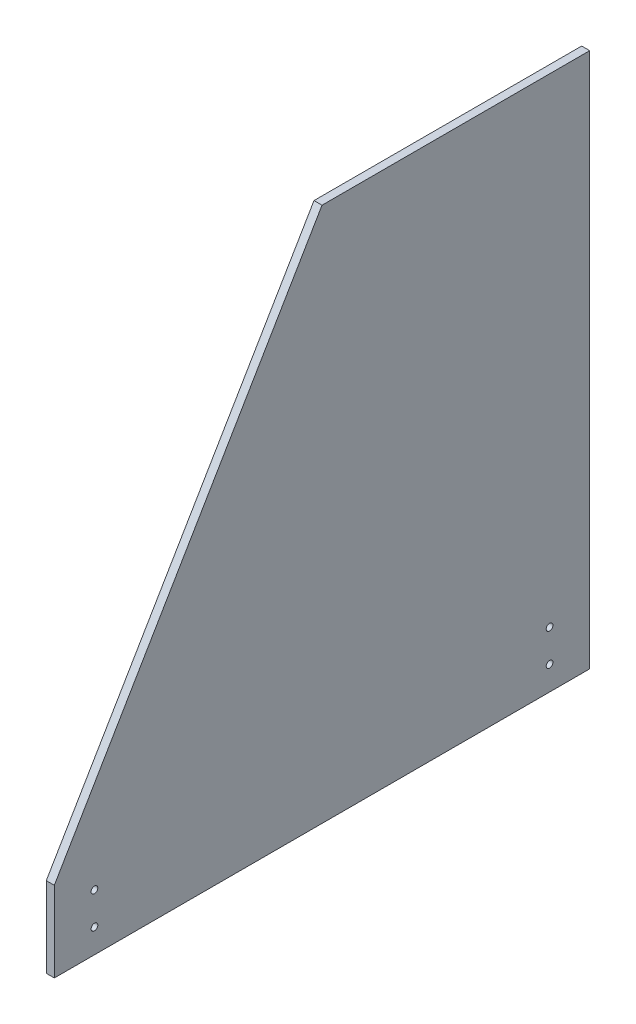
ISO-10303-21;
HEADER;
FILE_DESCRIPTION(('STEP AP214'),'2;1');
FILE_NAME('part.step','',(''),(''),'','','');
FILE_SCHEMA(('AUTOMOTIVE_DESIGN { 1 0 10303 214 1 1 1 1 }'));
ENDSEC;
DATA;
#1=APPLICATION_CONTEXT('core data for automotive mechanical design processes');
#2=APPLICATION_PROTOCOL_DEFINITION('international standard','automotive_design',2000,#1);
#3=PRODUCT_CONTEXT('',#1,'mechanical');
#4=PRODUCT('Part','Part','',(#3));
#5=PRODUCT_RELATED_PRODUCT_CATEGORY('part','',(#4));
#6=PRODUCT_DEFINITION_FORMATION('','',#4);
#7=PRODUCT_DEFINITION_CONTEXT('part definition',#1,'design');
#8=PRODUCT_DEFINITION('design','',#6,#7);
#9=PRODUCT_DEFINITION_SHAPE('','',#8);
#10=(LENGTH_UNIT() NAMED_UNIT(*) SI_UNIT(.MILLI.,.METRE.));
#11=(NAMED_UNIT(*) PLANE_ANGLE_UNIT() SI_UNIT($,.RADIAN.));
#12=(NAMED_UNIT(*) SI_UNIT($,.STERADIAN.) SOLID_ANGLE_UNIT());
#13=UNCERTAINTY_MEASURE_WITH_UNIT(LENGTH_MEASURE(1.E-05),#10,'distance_accuracy_value','');
#14=(GEOMETRIC_REPRESENTATION_CONTEXT(3) GLOBAL_UNCERTAINTY_ASSIGNED_CONTEXT((#13)) GLOBAL_UNIT_ASSIGNED_CONTEXT((#10,
#11,#12)) REPRESENTATION_CONTEXT('',''));
#15=CARTESIAN_POINT('',(0.,0.,0.));
#16=DIRECTION('',(0.,0.,1.));
#17=DIRECTION('',(1.,0.,0.));
#18=AXIS2_PLACEMENT_3D('',#15,#16,#17);
#19=CARTESIAN_POINT('',(6.,0.,0.));
#20=DIRECTION('',(1.,0.,0.));
#21=DIRECTION('',(0.,0.,-1.));
#22=AXIS2_PLACEMENT_3D('',#19,#20,#21);
#23=PLANE('',#22);
#24=CARTESIAN_POINT('',(6.,18.0000000000013,-370.));
#25=DIRECTION('',(1.,0.,0.));
#26=DIRECTION('',(0.,0.,-1.));
#27=AXIS2_PLACEMENT_3D('',#24,#25,#26);
#28=CIRCLE('',#27,2.49999999999997);
#29=CARTESIAN_POINT('',(6.,18.0000000000013,-372.5));
#30=VERTEX_POINT('',#29);
#31=EDGE_CURVE('E183',#30,#30,#28,.T.);
#32=ORIENTED_EDGE('',*,*,#31,.F.);
#33=EDGE_LOOP('',(#32));
#34=FACE_BOUND('',#33,.T.);
#35=CARTESIAN_POINT('',(6.,42.,-30.));
#36=DIRECTION('',(1.,0.,0.));
#37=DIRECTION('',(0.,0.,-1.));
#38=AXIS2_PLACEMENT_3D('',#35,#36,#37);
#39=CIRCLE('',#38,2.5);
#40=CARTESIAN_POINT('',(6.,42.,-32.5));
#41=VERTEX_POINT('',#40);
#42=EDGE_CURVE('E123',#41,#41,#39,.T.);
#43=ORIENTED_EDGE('',*,*,#42,.F.);
#44=EDGE_LOOP('',(#43));
#45=FACE_BOUND('',#44,.T.);
#46=DIRECTION('',(0.,-1.,0.));
#47=VECTOR('',#46,1.);
#48=CARTESIAN_POINT('',(6.,60.,0.));
#49=LINE('',#48,#47);
#50=CARTESIAN_POINT('',(6.,60.,0.));
#51=VERTEX_POINT('',#50);
#52=CARTESIAN_POINT('',(6.,0.,0.));
#53=VERTEX_POINT('',#52);
#54=EDGE_CURVE('E128',#51,#53,#49,.T.);
#55=ORIENTED_EDGE('',*,*,#54,.T.);
#56=DIRECTION('',(0.,0.,-1.));
#57=VECTOR('',#56,1.);
#58=CARTESIAN_POINT('',(6.,0.,0.));
#59=LINE('',#58,#57);
#60=CARTESIAN_POINT('',(6.,0.,-400.));
#61=VERTEX_POINT('',#60);
#62=EDGE_CURVE('E94',#53,#61,#59,.T.);
#63=ORIENTED_EDGE('',*,*,#62,.T.);
#64=DIRECTION('',(0.,1.,0.));
#65=VECTOR('',#64,1.);
#66=CARTESIAN_POINT('',(6.,0.,-400.));
#67=LINE('',#66,#65);
#68=CARTESIAN_POINT('',(6.,400.,-400.));
#69=VERTEX_POINT('',#68);
#70=EDGE_CURVE('E98',#61,#69,#67,.T.);
#71=ORIENTED_EDGE('',*,*,#70,.T.);
#72=DIRECTION('',(0.,0.,1.));
#73=VECTOR('',#72,1.);
#74=CARTESIAN_POINT('',(6.,400.,-200.));
#75=LINE('',#74,#73);
#76=CARTESIAN_POINT('',(6.,400.,-200.));
#77=VERTEX_POINT('',#76);
#78=EDGE_CURVE('E102',#69,#77,#75,.T.);
#79=ORIENTED_EDGE('',*,*,#78,.T.);
#80=DIRECTION('',(0.,-0.86193421515777,0.507020126563394));
#81=VECTOR('',#80,1.);
#82=CARTESIAN_POINT('',(6.,60.,0.));
#83=LINE('',#82,#81);
#84=EDGE_CURVE('E60',#77,#51,#83,.T.);
#85=ORIENTED_EDGE('',*,*,#84,.T.);
#86=EDGE_LOOP('',(#55,#63,#71,#79,#85));
#87=FACE_BOUND('',#86,.T.);
#88=CARTESIAN_POINT('',(6.,18.,-30.));
#89=DIRECTION('',(1.,0.,0.));
#90=DIRECTION('',(0.,0.,1.));
#91=AXIS2_PLACEMENT_3D('',#88,#89,#90);
#92=CIRCLE('',#91,2.5);
#93=CARTESIAN_POINT('',(6.,18.,-27.5));
#94=VERTEX_POINT('',#93);
#95=EDGE_CURVE('E189',#94,#94,#92,.T.);
#96=ORIENTED_EDGE('',*,*,#95,.F.);
#97=EDGE_LOOP('',(#96));
#98=FACE_BOUND('',#97,.T.);
#99=CARTESIAN_POINT('',(6.,42.0000000000013,-370.));
#100=DIRECTION('',(1.,0.,0.));
#101=DIRECTION('',(0.,0.,1.));
#102=AXIS2_PLACEMENT_3D('',#99,#100,#101);
#103=CIRCLE('',#102,2.49999999999997);
#104=CARTESIAN_POINT('',(6.,42.0000000000013,-367.5));
#105=VERTEX_POINT('',#104);
#106=EDGE_CURVE('E174',#105,#105,#103,.T.);
#107=ORIENTED_EDGE('',*,*,#106,.F.);
#108=EDGE_LOOP('',(#107));
#109=FACE_BOUND('',#108,.T.);
#110=ADVANCED_FACE('F43',(#34,#45,#87,#98,#109),#23,.T.);
#111=CARTESIAN_POINT('',(0.,0.,0.));
#112=DIRECTION('',(1.,0.,0.));
#113=DIRECTION('',(0.,0.,-1.));
#114=AXIS2_PLACEMENT_3D('',#111,#112,#113);
#115=PLANE('',#114);
#116=DIRECTION('',(0.,-1.,0.));
#117=VECTOR('',#116,1.);
#118=CARTESIAN_POINT('',(0.,60.,0.));
#119=LINE('',#118,#117);
#120=CARTESIAN_POINT('',(0.,60.,0.));
#121=VERTEX_POINT('',#120);
#122=CARTESIAN_POINT('',(0.,0.,0.));
#123=VERTEX_POINT('',#122);
#124=EDGE_CURVE('E119',#121,#123,#119,.T.);
#125=ORIENTED_EDGE('',*,*,#124,.F.);
#126=DIRECTION('',(0.,-0.86193421515777,0.507020126563394));
#127=VECTOR('',#126,1.);
#128=CARTESIAN_POINT('',(0.,60.,0.));
#129=LINE('',#128,#127);
#130=CARTESIAN_POINT('',(0.,400.,-200.));
#131=VERTEX_POINT('',#130);
#132=EDGE_CURVE('E86',#131,#121,#129,.T.);
#133=ORIENTED_EDGE('',*,*,#132,.F.);
#134=DIRECTION('',(0.,0.,1.));
#135=VECTOR('',#134,1.);
#136=CARTESIAN_POINT('',(0.,400.,-200.));
#137=LINE('',#136,#135);
#138=CARTESIAN_POINT('',(0.,400.,-400.));
#139=VERTEX_POINT('',#138);
#140=EDGE_CURVE('E80',#139,#131,#137,.T.);
#141=ORIENTED_EDGE('',*,*,#140,.F.);
#142=DIRECTION('',(0.,1.,0.));
#143=VECTOR('',#142,1.);
#144=CARTESIAN_POINT('',(0.,0.,-400.));
#145=LINE('',#144,#143);
#146=CARTESIAN_POINT('',(0.,0.,-400.));
#147=VERTEX_POINT('',#146);
#148=EDGE_CURVE('E109',#147,#139,#145,.T.);
#149=ORIENTED_EDGE('',*,*,#148,.F.);
#150=DIRECTION('',(0.,0.,-1.));
#151=VECTOR('',#150,1.);
#152=CARTESIAN_POINT('',(0.,0.,0.));
#153=LINE('',#152,#151);
#154=EDGE_CURVE('E122',#123,#147,#153,.T.);
#155=ORIENTED_EDGE('',*,*,#154,.F.);
#156=EDGE_LOOP('',(#125,#133,#141,#149,#155));
#157=FACE_BOUND('',#156,.T.);
#158=CARTESIAN_POINT('',(0.,42.,-30.));
#159=DIRECTION('',(1.,0.,0.));
#160=DIRECTION('',(0.,0.,-1.));
#161=AXIS2_PLACEMENT_3D('',#158,#159,#160);
#162=CIRCLE('',#161,2.5);
#163=CARTESIAN_POINT('',(0.,42.,-32.5));
#164=VERTEX_POINT('',#163);
#165=EDGE_CURVE('E192',#164,#164,#162,.T.);
#166=ORIENTED_EDGE('',*,*,#165,.T.);
#167=EDGE_LOOP('',(#166));
#168=FACE_BOUND('',#167,.T.);
#169=CARTESIAN_POINT('',(0.,18.,-30.));
#170=DIRECTION('',(1.,0.,0.));
#171=DIRECTION('',(0.,0.,1.));
#172=AXIS2_PLACEMENT_3D('',#169,#170,#171);
#173=CIRCLE('',#172,2.5);
#174=CARTESIAN_POINT('',(0.,18.,-27.5));
#175=VERTEX_POINT('',#174);
#176=EDGE_CURVE('E186',#175,#175,#173,.T.);
#177=ORIENTED_EDGE('',*,*,#176,.T.);
#178=EDGE_LOOP('',(#177));
#179=FACE_BOUND('',#178,.T.);
#180=CARTESIAN_POINT('',(0.,18.0000000000013,-370.));
#181=DIRECTION('',(1.,0.,0.));
#182=DIRECTION('',(0.,0.,-1.));
#183=AXIS2_PLACEMENT_3D('',#180,#181,#182);
#184=CIRCLE('',#183,2.49999999999997);
#185=CARTESIAN_POINT('',(0.,18.0000000000013,-372.5));
#186=VERTEX_POINT('',#185);
#187=EDGE_CURVE('E180',#186,#186,#184,.T.);
#188=ORIENTED_EDGE('',*,*,#187,.T.);
#189=EDGE_LOOP('',(#188));
#190=FACE_BOUND('',#189,.T.);
#191=CARTESIAN_POINT('',(0.,42.0000000000013,-370.));
#192=DIRECTION('',(1.,0.,0.));
#193=DIRECTION('',(0.,0.,1.));
#194=AXIS2_PLACEMENT_3D('',#191,#192,#193);
#195=CIRCLE('',#194,2.49999999999997);
#196=CARTESIAN_POINT('',(0.,42.0000000000013,-367.5));
#197=VERTEX_POINT('',#196);
#198=EDGE_CURVE('E177',#197,#197,#195,.T.);
#199=ORIENTED_EDGE('',*,*,#198,.T.);
#200=EDGE_LOOP('',(#199));
#201=FACE_BOUND('',#200,.T.);
#202=ADVANCED_FACE('F132',(#157,#168,#179,#190,#201),#115,.F.);
#203=CARTESIAN_POINT('',(6.,60.,0.));
#204=DIRECTION('',(0.,0.,-1.));
#205=DIRECTION('',(-1.,0.,0.));
#206=AXIS2_PLACEMENT_3D('',#203,#204,#205);
#207=PLANE('',#206);
#208=ORIENTED_EDGE('',*,*,#124,.T.);
#209=DIRECTION('',(-1.,0.,0.));
#210=VECTOR('',#209,1.);
#211=CARTESIAN_POINT('',(6.,0.,0.));
#212=LINE('',#211,#210);
#213=EDGE_CURVE('E12',#53,#123,#212,.T.);
#214=ORIENTED_EDGE('',*,*,#213,.F.);
#215=ORIENTED_EDGE('',*,*,#54,.F.);
#216=DIRECTION('',(-1.,0.,0.));
#217=VECTOR('',#216,1.);
#218=CARTESIAN_POINT('',(6.,60.,0.));
#219=LINE('',#218,#217);
#220=EDGE_CURVE('E114',#51,#121,#219,.T.);
#221=ORIENTED_EDGE('',*,*,#220,.T.);
#222=EDGE_LOOP('',(#208,#214,#215,#221));
#223=FACE_BOUND('',#222,.T.);
#224=ADVANCED_FACE('F45',(#223),#207,.F.);
#225=CARTESIAN_POINT('',(6.,0.,0.));
#226=DIRECTION('',(0.,1.,0.));
#227=DIRECTION('',(0.,0.,1.));
#228=AXIS2_PLACEMENT_3D('',#225,#226,#227);
#229=PLANE('',#228);
#230=ORIENTED_EDGE('',*,*,#154,.T.);
#231=DIRECTION('',(-1.,0.,0.));
#232=VECTOR('',#231,1.);
#233=CARTESIAN_POINT('',(6.,0.,-400.));
#234=LINE('',#233,#232);
#235=EDGE_CURVE('E52',#61,#147,#234,.T.);
#236=ORIENTED_EDGE('',*,*,#235,.F.);
#237=ORIENTED_EDGE('',*,*,#62,.F.);
#238=ORIENTED_EDGE('',*,*,#213,.T.);
#239=EDGE_LOOP('',(#230,#236,#237,#238));
#240=FACE_BOUND('',#239,.T.);
#241=ADVANCED_FACE('F241',(#240),#229,.F.);
#242=CARTESIAN_POINT('',(6.,0.,-400.));
#243=DIRECTION('',(0.,0.,1.));
#244=DIRECTION('',(1.,0.,0.));
#245=AXIS2_PLACEMENT_3D('',#242,#243,#244);
#246=PLANE('',#245);
#247=ORIENTED_EDGE('',*,*,#148,.T.);
#248=DIRECTION('',(-1.,0.,0.));
#249=VECTOR('',#248,1.);
#250=CARTESIAN_POINT('',(6.,400.,-400.));
#251=LINE('',#250,#249);
#252=EDGE_CURVE('E106',#69,#139,#251,.T.);
#253=ORIENTED_EDGE('',*,*,#252,.F.);
#254=ORIENTED_EDGE('',*,*,#70,.F.);
#255=ORIENTED_EDGE('',*,*,#235,.T.);
#256=EDGE_LOOP('',(#247,#253,#254,#255));
#257=FACE_BOUND('',#256,.T.);
#258=ADVANCED_FACE('F107',(#257),#246,.F.);
#259=CARTESIAN_POINT('',(6.,400.,-200.));
#260=DIRECTION('',(0.,-1.,0.));
#261=DIRECTION('',(0.,0.,-1.));
#262=AXIS2_PLACEMENT_3D('',#259,#260,#261);
#263=PLANE('',#262);
#264=ORIENTED_EDGE('',*,*,#140,.T.);
#265=DIRECTION('',(-1.,0.,0.));
#266=VECTOR('',#265,1.);
#267=CARTESIAN_POINT('',(6.,400.,-200.));
#268=LINE('',#267,#266);
#269=EDGE_CURVE('E110',#77,#131,#268,.T.);
#270=ORIENTED_EDGE('',*,*,#269,.F.);
#271=ORIENTED_EDGE('',*,*,#78,.F.);
#272=ORIENTED_EDGE('',*,*,#252,.T.);
#273=EDGE_LOOP('',(#264,#270,#271,#272));
#274=FACE_BOUND('',#273,.T.);
#275=ADVANCED_FACE('F112',(#274),#263,.F.);
#276=CARTESIAN_POINT('',(6.,60.,0.));
#277=DIRECTION('',(0.,-0.507020126563394,-0.86193421515777));
#278=DIRECTION('',(0.,0.86193421515777,-0.507020126563394));
#279=AXIS2_PLACEMENT_3D('',#276,#277,#278);
#280=PLANE('',#279);
#281=ORIENTED_EDGE('',*,*,#132,.T.);
#282=ORIENTED_EDGE('',*,*,#220,.F.);
#283=ORIENTED_EDGE('',*,*,#84,.F.);
#284=ORIENTED_EDGE('',*,*,#269,.T.);
#285=EDGE_LOOP('',(#281,#282,#283,#284));
#286=FACE_BOUND('',#285,.T.);
#287=ADVANCED_FACE('F137',(#286),#280,.F.);
#288=CARTESIAN_POINT('',(6.,42.,-30.));
#289=DIRECTION('',(-1.,0.,0.));
#290=DIRECTION('',(0.,0.,1.));
#291=AXIS2_PLACEMENT_3D('',#288,#289,#290);
#292=CYLINDRICAL_SURFACE('',#291,2.5);
#293=ORIENTED_EDGE('',*,*,#42,.T.);
#294=EDGE_LOOP('',(#293));
#295=FACE_BOUND('',#294,.T.);
#296=ORIENTED_EDGE('',*,*,#165,.F.);
#297=EDGE_LOOP('',(#296));
#298=FACE_BOUND('',#297,.T.);
#299=ADVANCED_FACE('F139',(#295,#298),#292,.F.);
#300=CARTESIAN_POINT('',(6.,18.,-30.));
#301=DIRECTION('',(-1.,0.,0.));
#302=DIRECTION('',(0.,0.,1.));
#303=AXIS2_PLACEMENT_3D('',#300,#301,#302);
#304=CYLINDRICAL_SURFACE('',#303,2.5);
#305=ORIENTED_EDGE('',*,*,#95,.T.);
#306=EDGE_LOOP('',(#305));
#307=FACE_BOUND('',#306,.T.);
#308=ORIENTED_EDGE('',*,*,#176,.F.);
#309=EDGE_LOOP('',(#308));
#310=FACE_BOUND('',#309,.T.);
#311=ADVANCED_FACE('F145',(#307,#310),#304,.F.);
#312=CARTESIAN_POINT('',(6.,18.0000000000013,-370.));
#313=DIRECTION('',(-1.,0.,0.));
#314=DIRECTION('',(0.,0.,1.));
#315=AXIS2_PLACEMENT_3D('',#312,#313,#314);
#316=CYLINDRICAL_SURFACE('',#315,2.49999999999997);
#317=ORIENTED_EDGE('',*,*,#31,.T.);
#318=EDGE_LOOP('',(#317));
#319=FACE_BOUND('',#318,.T.);
#320=ORIENTED_EDGE('',*,*,#187,.F.);
#321=EDGE_LOOP('',(#320));
#322=FACE_BOUND('',#321,.T.);
#323=ADVANCED_FACE('F161',(#319,#322),#316,.F.);
#324=CARTESIAN_POINT('',(6.,42.0000000000013,-370.));
#325=DIRECTION('',(-1.,0.,0.));
#326=DIRECTION('',(0.,0.,1.));
#327=AXIS2_PLACEMENT_3D('',#324,#325,#326);
#328=CYLINDRICAL_SURFACE('',#327,2.49999999999997);
#329=ORIENTED_EDGE('',*,*,#106,.T.);
#330=EDGE_LOOP('',(#329));
#331=FACE_BOUND('',#330,.T.);
#332=ORIENTED_EDGE('',*,*,#198,.F.);
#333=EDGE_LOOP('',(#332));
#334=FACE_BOUND('',#333,.T.);
#335=ADVANCED_FACE('F165',(#331,#334),#328,.F.);
#336=CLOSED_SHELL('',(#110,#202,#224,#241,#258,#275,#287,#299,#311,#323,#335));
#337=MANIFOLD_SOLID_BREP('B2',#336);
#338=ADVANCED_BREP_SHAPE_REPRESENTATION('',(#18,#337),#14);
#339=SHAPE_DEFINITION_REPRESENTATION(#9,#338);
ENDSEC;
END-ISO-10303-21;
